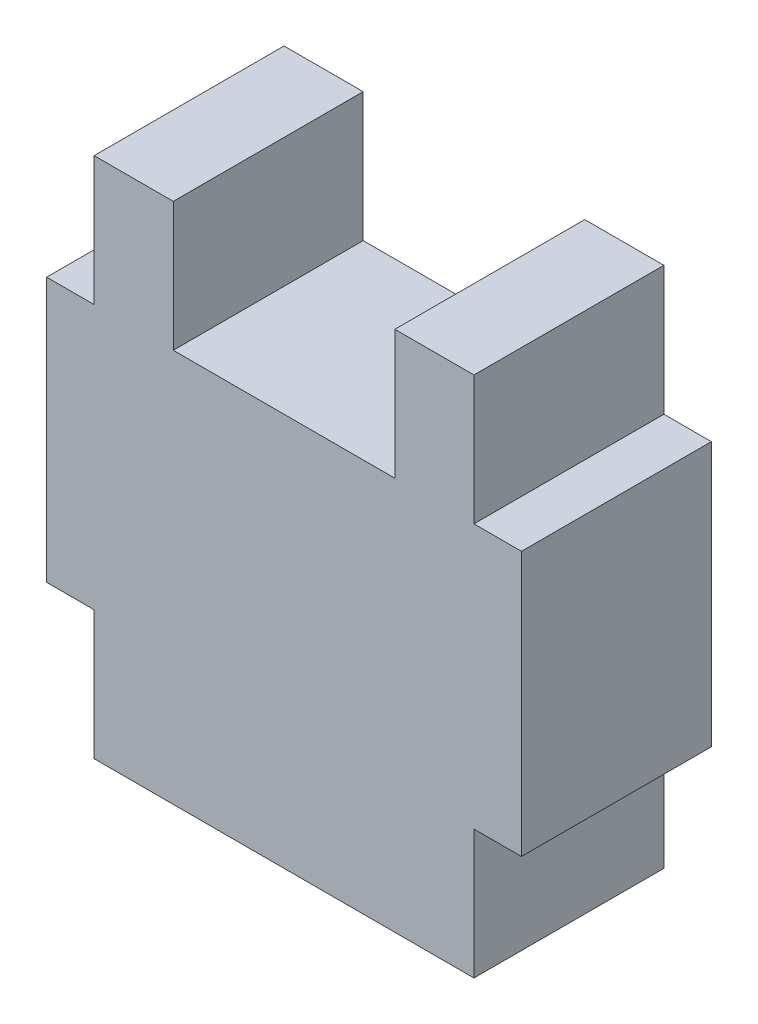
ISO-10303-21;
HEADER;
FILE_DESCRIPTION(('STEP AP214'),'2;1');
FILE_NAME('part.step','',(''),(''),'','','');
FILE_SCHEMA(('AUTOMOTIVE_DESIGN { 1 0 10303 214 1 1 1 1 }'));
ENDSEC;
DATA;
#1=APPLICATION_CONTEXT('core data for automotive mechanical design processes');
#2=APPLICATION_PROTOCOL_DEFINITION('international standard','automotive_design',2000,#1);
#3=PRODUCT_CONTEXT('',#1,'mechanical');
#4=PRODUCT('Part','Part','',(#3));
#5=PRODUCT_RELATED_PRODUCT_CATEGORY('part','',(#4));
#6=PRODUCT_DEFINITION_FORMATION('','',#4);
#7=PRODUCT_DEFINITION_CONTEXT('part definition',#1,'design');
#8=PRODUCT_DEFINITION('design','',#6,#7);
#9=PRODUCT_DEFINITION_SHAPE('','',#8);
#10=(LENGTH_UNIT() NAMED_UNIT(*) SI_UNIT(.MILLI.,.METRE.));
#11=(NAMED_UNIT(*) PLANE_ANGLE_UNIT() SI_UNIT($,.RADIAN.));
#12=(NAMED_UNIT(*) SI_UNIT($,.STERADIAN.) SOLID_ANGLE_UNIT());
#13=UNCERTAINTY_MEASURE_WITH_UNIT(LENGTH_MEASURE(1.E-05),#10,'distance_accuracy_value','');
#14=(GEOMETRIC_REPRESENTATION_CONTEXT(3) GLOBAL_UNCERTAINTY_ASSIGNED_CONTEXT((#13)) GLOBAL_UNIT_ASSIGNED_CONTEXT((#10,
#11,#12)) REPRESENTATION_CONTEXT('',''));
#15=CARTESIAN_POINT('',(0.,0.,0.));
#16=DIRECTION('',(0.,0.,1.));
#17=DIRECTION('',(1.,0.,0.));
#18=AXIS2_PLACEMENT_3D('',#15,#16,#17);
#19=CARTESIAN_POINT('',(-1.5,0.835,1.2));
#20=DIRECTION('',(1.,0.,0.));
#21=DIRECTION('',(0.,0.,-1.));
#22=AXIS2_PLACEMENT_3D('',#19,#20,#21);
#23=PLANE('',#22);
#24=DIRECTION('',(0.,-1.,0.));
#25=VECTOR('',#24,1.);
#26=CARTESIAN_POINT('',(-1.5,0.835,0.));
#27=LINE('',#26,#25);
#28=CARTESIAN_POINT('',(-1.5,0.835,0.));
#29=VERTEX_POINT('',#28);
#30=CARTESIAN_POINT('',(-1.5,-0.835,0.));
#31=VERTEX_POINT('',#30);
#32=EDGE_CURVE('E178',#29,#31,#27,.T.);
#33=ORIENTED_EDGE('',*,*,#32,.T.);
#34=DIRECTION('',(0.,0.,-1.));
#35=VECTOR('',#34,1.);
#36=CARTESIAN_POINT('',(-1.5,-0.835,1.2));
#37=LINE('',#36,#35);
#38=CARTESIAN_POINT('',(-1.5,-0.835,1.2));
#39=VERTEX_POINT('',#38);
#40=EDGE_CURVE('E11',#39,#31,#37,.T.);
#41=ORIENTED_EDGE('',*,*,#40,.F.);
#42=DIRECTION('',(0.,-1.,0.));
#43=VECTOR('',#42,1.);
#44=CARTESIAN_POINT('',(-1.5,0.835,1.2));
#45=LINE('',#44,#43);
#46=CARTESIAN_POINT('',(-1.5,0.835,1.2));
#47=VERTEX_POINT('',#46);
#48=EDGE_CURVE('E208',#47,#39,#45,.T.);
#49=ORIENTED_EDGE('',*,*,#48,.F.);
#50=DIRECTION('',(0.,0.,-1.));
#51=VECTOR('',#50,1.);
#52=CARTESIAN_POINT('',(-1.5,0.835,1.2));
#53=LINE('',#52,#51);
#54=EDGE_CURVE('E174',#47,#29,#53,.T.);
#55=ORIENTED_EDGE('',*,*,#54,.T.);
#56=EDGE_LOOP('',(#33,#41,#49,#55));
#57=FACE_BOUND('',#56,.T.);
#58=ADVANCED_FACE('F34',(#57),#23,.F.);
#59=CARTESIAN_POINT('',(-1.5,-0.835,1.2));
#60=DIRECTION('',(0.,1.,0.));
#61=DIRECTION('',(0.,0.,1.));
#62=AXIS2_PLACEMENT_3D('',#59,#60,#61);
#63=PLANE('',#62);
#64=DIRECTION('',(1.,0.,0.));
#65=VECTOR('',#64,1.);
#66=CARTESIAN_POINT('',(-1.5,-0.835,0.));
#67=LINE('',#66,#65);
#68=CARTESIAN_POINT('',(-1.2,-0.835,0.));
#69=VERTEX_POINT('',#68);
#70=EDGE_CURVE('E181',#31,#69,#67,.T.);
#71=ORIENTED_EDGE('',*,*,#70,.T.);
#72=DIRECTION('',(0.,0.,-1.));
#73=VECTOR('',#72,1.);
#74=CARTESIAN_POINT('',(-1.2,-0.835,1.2));
#75=LINE('',#74,#73);
#76=CARTESIAN_POINT('',(-1.2,-0.835,1.2));
#77=VERTEX_POINT('',#76);
#78=EDGE_CURVE('E42',#77,#69,#75,.T.);
#79=ORIENTED_EDGE('',*,*,#78,.F.);
#80=DIRECTION('',(1.,0.,0.));
#81=VECTOR('',#80,1.);
#82=CARTESIAN_POINT('',(-1.5,-0.835,1.2));
#83=LINE('',#82,#81);
#84=EDGE_CURVE('E117',#39,#77,#83,.T.);
#85=ORIENTED_EDGE('',*,*,#84,.F.);
#86=ORIENTED_EDGE('',*,*,#40,.T.);
#87=EDGE_LOOP('',(#71,#79,#85,#86));
#88=FACE_BOUND('',#87,.T.);
#89=ADVANCED_FACE('F306',(#88),#63,.F.);
#90=CARTESIAN_POINT('',(-1.2,-0.835,1.2));
#91=DIRECTION('',(1.,0.,0.));
#92=DIRECTION('',(0.,0.,-1.));
#93=AXIS2_PLACEMENT_3D('',#90,#91,#92);
#94=PLANE('',#93);
#95=DIRECTION('',(0.,-1.,0.));
#96=VECTOR('',#95,1.);
#97=CARTESIAN_POINT('',(-1.2,-0.835,0.));
#98=LINE('',#97,#96);
#99=CARTESIAN_POINT('',(-1.2,-1.65,0.));
#100=VERTEX_POINT('',#99);
#101=EDGE_CURVE('E183',#69,#100,#98,.T.);
#102=ORIENTED_EDGE('',*,*,#101,.T.);
#103=DIRECTION('',(0.,0.,-1.));
#104=VECTOR('',#103,1.);
#105=CARTESIAN_POINT('',(-1.2,-1.65,1.2));
#106=LINE('',#105,#104);
#107=CARTESIAN_POINT('',(-1.2,-1.65,1.2));
#108=VERTEX_POINT('',#107);
#109=EDGE_CURVE('E239',#108,#100,#106,.T.);
#110=ORIENTED_EDGE('',*,*,#109,.F.);
#111=DIRECTION('',(0.,-1.,0.));
#112=VECTOR('',#111,1.);
#113=CARTESIAN_POINT('',(-1.2,-0.835,1.2));
#114=LINE('',#113,#112);
#115=EDGE_CURVE('E247',#77,#108,#114,.T.);
#116=ORIENTED_EDGE('',*,*,#115,.F.);
#117=ORIENTED_EDGE('',*,*,#78,.T.);
#118=EDGE_LOOP('',(#102,#110,#116,#117));
#119=FACE_BOUND('',#118,.T.);
#120=ADVANCED_FACE('F245',(#119),#94,.F.);
#121=CARTESIAN_POINT('',(-1.2,-1.65,1.2));
#122=DIRECTION('',(0.,1.,0.));
#123=DIRECTION('',(0.,0.,1.));
#124=AXIS2_PLACEMENT_3D('',#121,#122,#123);
#125=PLANE('',#124);
#126=DIRECTION('',(1.,0.,0.));
#127=VECTOR('',#126,1.);
#128=CARTESIAN_POINT('',(-1.2,-1.65,0.));
#129=LINE('',#128,#127);
#130=CARTESIAN_POINT('',(1.2,-1.65,0.));
#131=VERTEX_POINT('',#130);
#132=EDGE_CURVE('E185',#100,#131,#129,.T.);
#133=ORIENTED_EDGE('',*,*,#132,.T.);
#134=DIRECTION('',(0.,0.,-1.));
#135=VECTOR('',#134,1.);
#136=CARTESIAN_POINT('',(1.2,-1.65,1.2));
#137=LINE('',#136,#135);
#138=CARTESIAN_POINT('',(1.2,-1.65,1.2));
#139=VERTEX_POINT('',#138);
#140=EDGE_CURVE('E236',#139,#131,#137,.T.);
#141=ORIENTED_EDGE('',*,*,#140,.F.);
#142=DIRECTION('',(1.,0.,0.));
#143=VECTOR('',#142,1.);
#144=CARTESIAN_POINT('',(-1.2,-1.65,1.2));
#145=LINE('',#144,#143);
#146=EDGE_CURVE('E265',#108,#139,#145,.T.);
#147=ORIENTED_EDGE('',*,*,#146,.F.);
#148=ORIENTED_EDGE('',*,*,#109,.T.);
#149=EDGE_LOOP('',(#133,#141,#147,#148));
#150=FACE_BOUND('',#149,.T.);
#151=ADVANCED_FACE('F256',(#150),#125,.F.);
#152=CARTESIAN_POINT('',(1.2,-1.65,1.2));
#153=DIRECTION('',(-1.,0.,0.));
#154=DIRECTION('',(0.,0.,1.));
#155=AXIS2_PLACEMENT_3D('',#152,#153,#154);
#156=PLANE('',#155);
#157=DIRECTION('',(0.,1.,0.));
#158=VECTOR('',#157,1.);
#159=CARTESIAN_POINT('',(1.2,-1.65,0.));
#160=LINE('',#159,#158);
#161=CARTESIAN_POINT('',(1.2,-0.835,0.));
#162=VERTEX_POINT('',#161);
#163=EDGE_CURVE('E187',#131,#162,#160,.T.);
#164=ORIENTED_EDGE('',*,*,#163,.T.);
#165=DIRECTION('',(0.,0.,-1.));
#166=VECTOR('',#165,1.);
#167=CARTESIAN_POINT('',(1.2,-0.835,1.2));
#168=LINE('',#167,#166);
#169=CARTESIAN_POINT('',(1.2,-0.835,1.2));
#170=VERTEX_POINT('',#169);
#171=EDGE_CURVE('E233',#170,#162,#168,.T.);
#172=ORIENTED_EDGE('',*,*,#171,.F.);
#173=DIRECTION('',(0.,1.,0.));
#174=VECTOR('',#173,1.);
#175=CARTESIAN_POINT('',(1.2,-1.65,1.2));
#176=LINE('',#175,#174);
#177=EDGE_CURVE('E262',#139,#170,#176,.T.);
#178=ORIENTED_EDGE('',*,*,#177,.F.);
#179=ORIENTED_EDGE('',*,*,#140,.T.);
#180=EDGE_LOOP('',(#164,#172,#178,#179));
#181=FACE_BOUND('',#180,.T.);
#182=ADVANCED_FACE('F260',(#181),#156,.F.);
#183=CARTESIAN_POINT('',(1.2,-0.835,1.2));
#184=DIRECTION('',(0.,1.,0.));
#185=DIRECTION('',(0.,0.,1.));
#186=AXIS2_PLACEMENT_3D('',#183,#184,#185);
#187=PLANE('',#186);
#188=DIRECTION('',(1.,0.,0.));
#189=VECTOR('',#188,1.);
#190=CARTESIAN_POINT('',(1.2,-0.835,0.));
#191=LINE('',#190,#189);
#192=CARTESIAN_POINT('',(1.5,-0.835,0.));
#193=VERTEX_POINT('',#192);
#194=EDGE_CURVE('E189',#162,#193,#191,.T.);
#195=ORIENTED_EDGE('',*,*,#194,.T.);
#196=DIRECTION('',(0.,0.,-1.));
#197=VECTOR('',#196,1.);
#198=CARTESIAN_POINT('',(1.5,-0.835,1.2));
#199=LINE('',#198,#197);
#200=CARTESIAN_POINT('',(1.5,-0.835,1.2));
#201=VERTEX_POINT('',#200);
#202=EDGE_CURVE('E230',#201,#193,#199,.T.);
#203=ORIENTED_EDGE('',*,*,#202,.F.);
#204=DIRECTION('',(1.,0.,0.));
#205=VECTOR('',#204,1.);
#206=CARTESIAN_POINT('',(1.2,-0.835,1.2));
#207=LINE('',#206,#205);
#208=EDGE_CURVE('E264',#170,#201,#207,.T.);
#209=ORIENTED_EDGE('',*,*,#208,.F.);
#210=ORIENTED_EDGE('',*,*,#171,.T.);
#211=EDGE_LOOP('',(#195,#203,#209,#210));
#212=FACE_BOUND('',#211,.T.);
#213=ADVANCED_FACE('F319',(#212),#187,.F.);
#214=CARTESIAN_POINT('',(1.5,-0.835,1.2));
#215=DIRECTION('',(-1.,0.,0.));
#216=DIRECTION('',(0.,0.,1.));
#217=AXIS2_PLACEMENT_3D('',#214,#215,#216);
#218=PLANE('',#217);
#219=DIRECTION('',(0.,1.,0.));
#220=VECTOR('',#219,1.);
#221=CARTESIAN_POINT('',(1.5,-0.835,0.));
#222=LINE('',#221,#220);
#223=CARTESIAN_POINT('',(1.5,0.835,0.));
#224=VERTEX_POINT('',#223);
#225=EDGE_CURVE('E191',#193,#224,#222,.T.);
#226=ORIENTED_EDGE('',*,*,#225,.T.);
#227=DIRECTION('',(0.,0.,-1.));
#228=VECTOR('',#227,1.);
#229=CARTESIAN_POINT('',(1.5,0.835,1.2));
#230=LINE('',#229,#228);
#231=CARTESIAN_POINT('',(1.5,0.835,1.2));
#232=VERTEX_POINT('',#231);
#233=EDGE_CURVE('E227',#232,#224,#230,.T.);
#234=ORIENTED_EDGE('',*,*,#233,.F.);
#235=DIRECTION('',(0.,1.,0.));
#236=VECTOR('',#235,1.);
#237=CARTESIAN_POINT('',(1.5,-0.835,1.2));
#238=LINE('',#237,#236);
#239=EDGE_CURVE('E267',#201,#232,#238,.T.);
#240=ORIENTED_EDGE('',*,*,#239,.F.);
#241=ORIENTED_EDGE('',*,*,#202,.T.);
#242=EDGE_LOOP('',(#226,#234,#240,#241));
#243=FACE_BOUND('',#242,.T.);
#244=ADVANCED_FACE('F322',(#243),#218,.F.);
#245=CARTESIAN_POINT('',(1.5,0.835,1.2));
#246=DIRECTION('',(0.,-1.,0.));
#247=DIRECTION('',(0.,0.,-1.));
#248=AXIS2_PLACEMENT_3D('',#245,#246,#247);
#249=PLANE('',#248);
#250=DIRECTION('',(-1.,0.,0.));
#251=VECTOR('',#250,1.);
#252=CARTESIAN_POINT('',(1.5,0.835,0.));
#253=LINE('',#252,#251);
#254=CARTESIAN_POINT('',(1.2,0.835,0.));
#255=VERTEX_POINT('',#254);
#256=EDGE_CURVE('E193',#224,#255,#253,.T.);
#257=ORIENTED_EDGE('',*,*,#256,.T.);
#258=DIRECTION('',(0.,0.,-1.));
#259=VECTOR('',#258,1.);
#260=CARTESIAN_POINT('',(1.2,0.835,1.2));
#261=LINE('',#260,#259);
#262=CARTESIAN_POINT('',(1.2,0.835,1.2));
#263=VERTEX_POINT('',#262);
#264=EDGE_CURVE('E224',#263,#255,#261,.T.);
#265=ORIENTED_EDGE('',*,*,#264,.F.);
#266=DIRECTION('',(-1.,0.,0.));
#267=VECTOR('',#266,1.);
#268=CARTESIAN_POINT('',(1.5,0.835,1.2));
#269=LINE('',#268,#267);
#270=EDGE_CURVE('E273',#232,#263,#269,.T.);
#271=ORIENTED_EDGE('',*,*,#270,.F.);
#272=ORIENTED_EDGE('',*,*,#233,.T.);
#273=EDGE_LOOP('',(#257,#265,#271,#272));
#274=FACE_BOUND('',#273,.T.);
#275=ADVANCED_FACE('F326',(#274),#249,.F.);
#276=CARTESIAN_POINT('',(1.2,0.835,1.2));
#277=DIRECTION('',(-1.,0.,0.));
#278=DIRECTION('',(0.,0.,1.));
#279=AXIS2_PLACEMENT_3D('',#276,#277,#278);
#280=PLANE('',#279);
#281=DIRECTION('',(0.,1.,0.));
#282=VECTOR('',#281,1.);
#283=CARTESIAN_POINT('',(1.2,0.835,0.));
#284=LINE('',#283,#282);
#285=CARTESIAN_POINT('',(1.2,1.65,0.));
#286=VERTEX_POINT('',#285);
#287=EDGE_CURVE('E195',#255,#286,#284,.T.);
#288=ORIENTED_EDGE('',*,*,#287,.T.);
#289=DIRECTION('',(0.,0.,-1.));
#290=VECTOR('',#289,1.);
#291=CARTESIAN_POINT('',(1.2,1.65,1.2));
#292=LINE('',#291,#290);
#293=CARTESIAN_POINT('',(1.2,1.65,1.2));
#294=VERTEX_POINT('',#293);
#295=EDGE_CURVE('E221',#294,#286,#292,.T.);
#296=ORIENTED_EDGE('',*,*,#295,.F.);
#297=DIRECTION('',(0.,1.,0.));
#298=VECTOR('',#297,1.);
#299=CARTESIAN_POINT('',(1.2,0.835,1.2));
#300=LINE('',#299,#298);
#301=EDGE_CURVE('E275',#263,#294,#300,.T.);
#302=ORIENTED_EDGE('',*,*,#301,.F.);
#303=ORIENTED_EDGE('',*,*,#264,.T.);
#304=EDGE_LOOP('',(#288,#296,#302,#303));
#305=FACE_BOUND('',#304,.T.);
#306=ADVANCED_FACE('F330',(#305),#280,.F.);
#307=CARTESIAN_POINT('',(1.2,1.65,1.2));
#308=DIRECTION('',(0.,-1.,0.));
#309=DIRECTION('',(0.,0.,-1.));
#310=AXIS2_PLACEMENT_3D('',#307,#308,#309);
#311=PLANE('',#310);
#312=DIRECTION('',(-1.,0.,0.));
#313=VECTOR('',#312,1.);
#314=CARTESIAN_POINT('',(1.2,1.65,0.));
#315=LINE('',#314,#313);
#316=CARTESIAN_POINT('',(0.7,1.65,0.));
#317=VERTEX_POINT('',#316);
#318=EDGE_CURVE('E197',#286,#317,#315,.T.);
#319=ORIENTED_EDGE('',*,*,#318,.T.);
#320=DIRECTION('',(0.,0.,-1.));
#321=VECTOR('',#320,1.);
#322=CARTESIAN_POINT('',(0.7,1.65,1.2));
#323=LINE('',#322,#321);
#324=CARTESIAN_POINT('',(0.7,1.65,1.2));
#325=VERTEX_POINT('',#324);
#326=EDGE_CURVE('E218',#325,#317,#323,.T.);
#327=ORIENTED_EDGE('',*,*,#326,.F.);
#328=DIRECTION('',(-1.,0.,0.));
#329=VECTOR('',#328,1.);
#330=CARTESIAN_POINT('',(1.2,1.65,1.2));
#331=LINE('',#330,#329);
#332=EDGE_CURVE('E277',#294,#325,#331,.T.);
#333=ORIENTED_EDGE('',*,*,#332,.F.);
#334=ORIENTED_EDGE('',*,*,#295,.T.);
#335=EDGE_LOOP('',(#319,#327,#333,#334));
#336=FACE_BOUND('',#335,.T.);
#337=ADVANCED_FACE('F334',(#336),#311,.F.);
#338=CARTESIAN_POINT('',(0.7,1.65,1.2));
#339=DIRECTION('',(1.,0.,0.));
#340=DIRECTION('',(0.,0.,-1.));
#341=AXIS2_PLACEMENT_3D('',#338,#339,#340);
#342=PLANE('',#341);
#343=DIRECTION('',(0.,-1.,0.));
#344=VECTOR('',#343,1.);
#345=CARTESIAN_POINT('',(0.7,1.65,0.));
#346=LINE('',#345,#344);
#347=CARTESIAN_POINT('',(0.7,0.835,0.));
#348=VERTEX_POINT('',#347);
#349=EDGE_CURVE('E199',#317,#348,#346,.T.);
#350=ORIENTED_EDGE('',*,*,#349,.T.);
#351=DIRECTION('',(0.,0.,-1.));
#352=VECTOR('',#351,1.);
#353=CARTESIAN_POINT('',(0.7,0.835,1.2));
#354=LINE('',#353,#352);
#355=CARTESIAN_POINT('',(0.7,0.835,1.2));
#356=VERTEX_POINT('',#355);
#357=EDGE_CURVE('E215',#356,#348,#354,.T.);
#358=ORIENTED_EDGE('',*,*,#357,.F.);
#359=DIRECTION('',(0.,-1.,0.));
#360=VECTOR('',#359,1.);
#361=CARTESIAN_POINT('',(0.7,1.65,1.2));
#362=LINE('',#361,#360);
#363=EDGE_CURVE('E279',#325,#356,#362,.T.);
#364=ORIENTED_EDGE('',*,*,#363,.F.);
#365=ORIENTED_EDGE('',*,*,#326,.T.);
#366=EDGE_LOOP('',(#350,#358,#364,#365));
#367=FACE_BOUND('',#366,.T.);
#368=ADVANCED_FACE('F338',(#367),#342,.F.);
#369=CARTESIAN_POINT('',(0.7,0.835,1.2));
#370=DIRECTION('',(0.,-1.,0.));
#371=DIRECTION('',(0.,0.,-1.));
#372=AXIS2_PLACEMENT_3D('',#369,#370,#371);
#373=PLANE('',#372);
#374=DIRECTION('',(-1.,0.,0.));
#375=VECTOR('',#374,1.);
#376=CARTESIAN_POINT('',(0.7,0.835,0.));
#377=LINE('',#376,#375);
#378=CARTESIAN_POINT('',(-0.7,0.835,0.));
#379=VERTEX_POINT('',#378);
#380=EDGE_CURVE('E201',#348,#379,#377,.T.);
#381=ORIENTED_EDGE('',*,*,#380,.T.);
#382=DIRECTION('',(0.,0.,-1.));
#383=VECTOR('',#382,1.);
#384=CARTESIAN_POINT('',(-0.7,0.835,1.2));
#385=LINE('',#384,#383);
#386=CARTESIAN_POINT('',(-0.7,0.835,1.2));
#387=VERTEX_POINT('',#386);
#388=EDGE_CURVE('E212',#387,#379,#385,.T.);
#389=ORIENTED_EDGE('',*,*,#388,.F.);
#390=DIRECTION('',(-1.,0.,0.));
#391=VECTOR('',#390,1.);
#392=CARTESIAN_POINT('',(0.7,0.835,1.2));
#393=LINE('',#392,#391);
#394=EDGE_CURVE('E281',#356,#387,#393,.T.);
#395=ORIENTED_EDGE('',*,*,#394,.F.);
#396=ORIENTED_EDGE('',*,*,#357,.T.);
#397=EDGE_LOOP('',(#381,#389,#395,#396));
#398=FACE_BOUND('',#397,.T.);
#399=ADVANCED_FACE('F287',(#398),#373,.F.);
#400=CARTESIAN_POINT('',(-0.7,0.835,1.2));
#401=DIRECTION('',(-1.,0.,0.));
#402=DIRECTION('',(0.,0.,1.));
#403=AXIS2_PLACEMENT_3D('',#400,#401,#402);
#404=PLANE('',#403);
#405=DIRECTION('',(0.,1.,0.));
#406=VECTOR('',#405,1.);
#407=CARTESIAN_POINT('',(-0.7,0.835,0.));
#408=LINE('',#407,#406);
#409=CARTESIAN_POINT('',(-0.7,1.65,0.));
#410=VERTEX_POINT('',#409);
#411=EDGE_CURVE('E203',#379,#410,#408,.T.);
#412=ORIENTED_EDGE('',*,*,#411,.T.);
#413=DIRECTION('',(0.,0.,-1.));
#414=VECTOR('',#413,1.);
#415=CARTESIAN_POINT('',(-0.7,1.65,1.2));
#416=LINE('',#415,#414);
#417=CARTESIAN_POINT('',(-0.7,1.65,1.2));
#418=VERTEX_POINT('',#417);
#419=EDGE_CURVE('E169',#418,#410,#416,.T.);
#420=ORIENTED_EDGE('',*,*,#419,.F.);
#421=DIRECTION('',(0.,1.,0.));
#422=VECTOR('',#421,1.);
#423=CARTESIAN_POINT('',(-0.7,0.835,1.2));
#424=LINE('',#423,#422);
#425=EDGE_CURVE('E160',#387,#418,#424,.T.);
#426=ORIENTED_EDGE('',*,*,#425,.F.);
#427=ORIENTED_EDGE('',*,*,#388,.T.);
#428=EDGE_LOOP('',(#412,#420,#426,#427));
#429=FACE_BOUND('',#428,.T.);
#430=ADVANCED_FACE('F291',(#429),#404,.F.);
#431=CARTESIAN_POINT('',(-0.7,1.65,1.2));
#432=DIRECTION('',(0.,-1.,0.));
#433=DIRECTION('',(0.,0.,-1.));
#434=AXIS2_PLACEMENT_3D('',#431,#432,#433);
#435=PLANE('',#434);
#436=DIRECTION('',(-1.,0.,0.));
#437=VECTOR('',#436,1.);
#438=CARTESIAN_POINT('',(-0.7,1.65,0.));
#439=LINE('',#438,#437);
#440=CARTESIAN_POINT('',(-1.2,1.65,0.));
#441=VERTEX_POINT('',#440);
#442=EDGE_CURVE('E168',#410,#441,#439,.T.);
#443=ORIENTED_EDGE('',*,*,#442,.T.);
#444=DIRECTION('',(0.,0.,-1.));
#445=VECTOR('',#444,1.);
#446=CARTESIAN_POINT('',(-1.2,1.65,1.2));
#447=LINE('',#446,#445);
#448=CARTESIAN_POINT('',(-1.2,1.65,1.2));
#449=VERTEX_POINT('',#448);
#450=EDGE_CURVE('E165',#449,#441,#447,.T.);
#451=ORIENTED_EDGE('',*,*,#450,.F.);
#452=DIRECTION('',(-1.,0.,0.));
#453=VECTOR('',#452,1.);
#454=CARTESIAN_POINT('',(-0.7,1.65,1.2));
#455=LINE('',#454,#453);
#456=EDGE_CURVE('E154',#418,#449,#455,.T.);
#457=ORIENTED_EDGE('',*,*,#456,.F.);
#458=ORIENTED_EDGE('',*,*,#419,.T.);
#459=EDGE_LOOP('',(#443,#451,#457,#458));
#460=FACE_BOUND('',#459,.T.);
#461=ADVANCED_FACE('F166',(#460),#435,.F.);
#462=CARTESIAN_POINT('',(-1.2,1.65,1.2));
#463=DIRECTION('',(1.,0.,0.));
#464=DIRECTION('',(0.,0.,-1.));
#465=AXIS2_PLACEMENT_3D('',#462,#463,#464);
#466=PLANE('',#465);
#467=DIRECTION('',(0.,-1.,0.));
#468=VECTOR('',#467,1.);
#469=CARTESIAN_POINT('',(-1.2,1.65,0.));
#470=LINE('',#469,#468);
#471=CARTESIAN_POINT('',(-1.2,0.835,0.));
#472=VERTEX_POINT('',#471);
#473=EDGE_CURVE('E103',#441,#472,#470,.T.);
#474=ORIENTED_EDGE('',*,*,#473,.T.);
#475=DIRECTION('',(0.,0.,-1.));
#476=VECTOR('',#475,1.);
#477=CARTESIAN_POINT('',(-1.2,0.835,1.2));
#478=LINE('',#477,#476);
#479=CARTESIAN_POINT('',(-1.2,0.835,1.2));
#480=VERTEX_POINT('',#479);
#481=EDGE_CURVE('E170',#480,#472,#478,.T.);
#482=ORIENTED_EDGE('',*,*,#481,.F.);
#483=DIRECTION('',(0.,-1.,0.));
#484=VECTOR('',#483,1.);
#485=CARTESIAN_POINT('',(-1.2,1.65,1.2));
#486=LINE('',#485,#484);
#487=EDGE_CURVE('E158',#449,#480,#486,.T.);
#488=ORIENTED_EDGE('',*,*,#487,.F.);
#489=ORIENTED_EDGE('',*,*,#450,.T.);
#490=EDGE_LOOP('',(#474,#482,#488,#489));
#491=FACE_BOUND('',#490,.T.);
#492=ADVANCED_FACE('F172',(#491),#466,.F.);
#493=CARTESIAN_POINT('',(-1.2,0.835,1.2));
#494=DIRECTION('',(0.,-1.,0.));
#495=DIRECTION('',(0.,0.,-1.));
#496=AXIS2_PLACEMENT_3D('',#493,#494,#495);
#497=PLANE('',#496);
#498=DIRECTION('',(-1.,0.,0.));
#499=VECTOR('',#498,1.);
#500=CARTESIAN_POINT('',(-1.2,0.835,0.));
#501=LINE('',#500,#499);
#502=EDGE_CURVE('E109',#472,#29,#501,.T.);
#503=ORIENTED_EDGE('',*,*,#502,.T.);
#504=ORIENTED_EDGE('',*,*,#54,.F.);
#505=DIRECTION('',(-1.,0.,0.));
#506=VECTOR('',#505,1.);
#507=CARTESIAN_POINT('',(-1.2,0.835,1.2));
#508=LINE('',#507,#506);
#509=EDGE_CURVE('E50',#480,#47,#508,.T.);
#510=ORIENTED_EDGE('',*,*,#509,.F.);
#511=ORIENTED_EDGE('',*,*,#481,.T.);
#512=EDGE_LOOP('',(#503,#504,#510,#511));
#513=FACE_BOUND('',#512,.T.);
#514=ADVANCED_FACE('F295',(#513),#497,.F.);
#515=CARTESIAN_POINT('',(0.,0.,1.2));
#516=DIRECTION('',(0.,0.,1.));
#517=DIRECTION('',(1.,0.,0.));
#518=AXIS2_PLACEMENT_3D('',#515,#516,#517);
#519=PLANE('',#518);
#520=ORIENTED_EDGE('',*,*,#48,.T.);
#521=ORIENTED_EDGE('',*,*,#84,.T.);
#522=ORIENTED_EDGE('',*,*,#115,.T.);
#523=ORIENTED_EDGE('',*,*,#146,.T.);
#524=ORIENTED_EDGE('',*,*,#177,.T.);
#525=ORIENTED_EDGE('',*,*,#208,.T.);
#526=ORIENTED_EDGE('',*,*,#239,.T.);
#527=ORIENTED_EDGE('',*,*,#270,.T.);
#528=ORIENTED_EDGE('',*,*,#301,.T.);
#529=ORIENTED_EDGE('',*,*,#332,.T.);
#530=ORIENTED_EDGE('',*,*,#363,.T.);
#531=ORIENTED_EDGE('',*,*,#394,.T.);
#532=ORIENTED_EDGE('',*,*,#425,.T.);
#533=ORIENTED_EDGE('',*,*,#456,.T.);
#534=ORIENTED_EDGE('',*,*,#487,.T.);
#535=ORIENTED_EDGE('',*,*,#509,.T.);
#536=EDGE_LOOP('',(#520,#521,#522,#523,#524,#525,#526,#527,#528,#529,#530,#531,#532,#533,#534,#535));
#537=FACE_BOUND('',#536,.T.);
#538=ADVANCED_FACE('F156',(#537),#519,.T.);
#539=CARTESIAN_POINT('',(0.,0.,0.));
#540=DIRECTION('',(0.,0.,1.));
#541=DIRECTION('',(1.,0.,0.));
#542=AXIS2_PLACEMENT_3D('',#539,#540,#541);
#543=PLANE('',#542);
#544=ORIENTED_EDGE('',*,*,#32,.F.);
#545=ORIENTED_EDGE('',*,*,#502,.F.);
#546=ORIENTED_EDGE('',*,*,#473,.F.);
#547=ORIENTED_EDGE('',*,*,#442,.F.);
#548=ORIENTED_EDGE('',*,*,#411,.F.);
#549=ORIENTED_EDGE('',*,*,#380,.F.);
#550=ORIENTED_EDGE('',*,*,#349,.F.);
#551=ORIENTED_EDGE('',*,*,#318,.F.);
#552=ORIENTED_EDGE('',*,*,#287,.F.);
#553=ORIENTED_EDGE('',*,*,#256,.F.);
#554=ORIENTED_EDGE('',*,*,#225,.F.);
#555=ORIENTED_EDGE('',*,*,#194,.F.);
#556=ORIENTED_EDGE('',*,*,#163,.F.);
#557=ORIENTED_EDGE('',*,*,#132,.F.);
#558=ORIENTED_EDGE('',*,*,#101,.F.);
#559=ORIENTED_EDGE('',*,*,#70,.F.);
#560=EDGE_LOOP('',(#544,#545,#546,#547,#548,#549,#550,#551,#552,#553,#554,#555,#556,#557,#558,#559));
#561=FACE_BOUND('',#560,.T.);
#562=ADVANCED_FACE('F251',(#561),#543,.F.);
#563=CLOSED_SHELL('',(#58,#89,#120,#151,#182,#213,#244,#275,#306,#337,#368,#399,#430,#461,#492,
#514,#538,#562));
#564=MANIFOLD_SOLID_BREP('B2',#563);
#565=ADVANCED_BREP_SHAPE_REPRESENTATION('',(#18,#564),#14);
#566=SHAPE_DEFINITION_REPRESENTATION(#9,#565);
ENDSEC;
END-ISO-10303-21;
